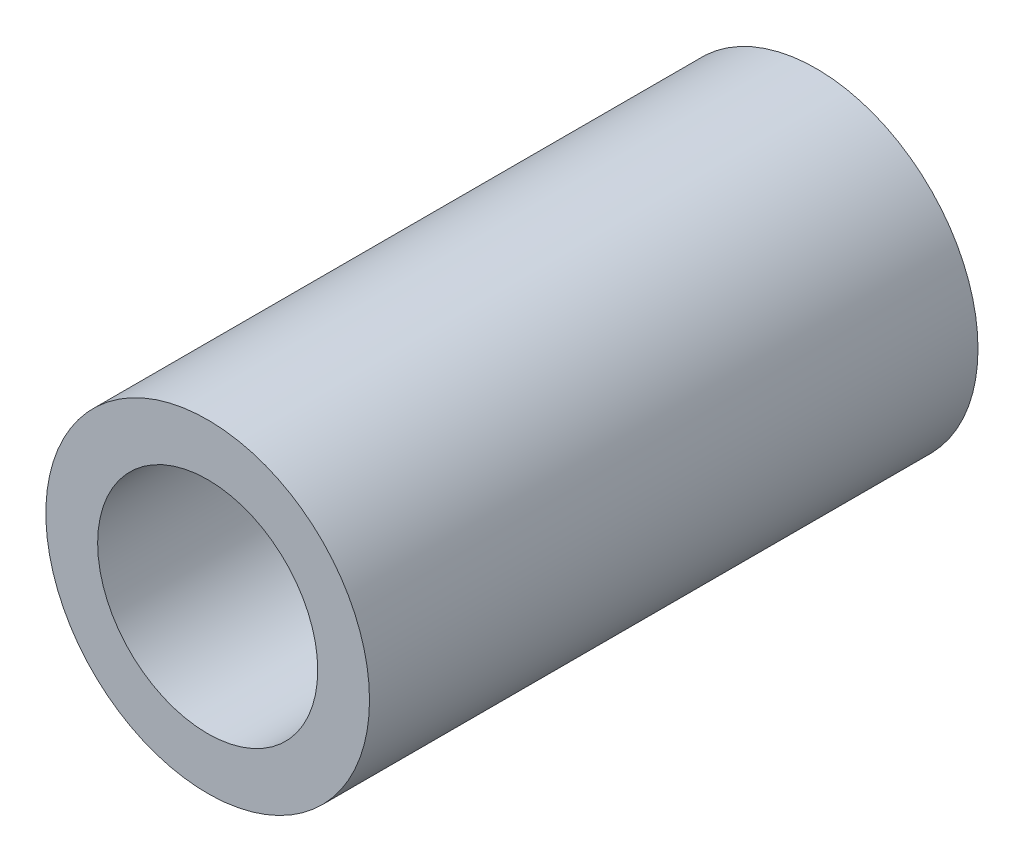
ISO-10303-21;
HEADER;
FILE_DESCRIPTION(('STEP AP214'),'2;1');
FILE_NAME('part.step','',(''),(''),'','','');
FILE_SCHEMA(('AUTOMOTIVE_DESIGN { 1 0 10303 214 1 1 1 1 }'));
ENDSEC;
DATA;
#1=APPLICATION_CONTEXT('core data for automotive mechanical design processes');
#2=APPLICATION_PROTOCOL_DEFINITION('international standard','automotive_design',2000,#1);
#3=PRODUCT_CONTEXT('',#1,'mechanical');
#4=PRODUCT('Part','Part','',(#3));
#5=PRODUCT_RELATED_PRODUCT_CATEGORY('part','',(#4));
#6=PRODUCT_DEFINITION_FORMATION('','',#4);
#7=PRODUCT_DEFINITION_CONTEXT('part definition',#1,'design');
#8=PRODUCT_DEFINITION('design','',#6,#7);
#9=PRODUCT_DEFINITION_SHAPE('','',#8);
#10=(LENGTH_UNIT() NAMED_UNIT(*) SI_UNIT(.MILLI.,.METRE.));
#11=(NAMED_UNIT(*) PLANE_ANGLE_UNIT() SI_UNIT($,.RADIAN.));
#12=(NAMED_UNIT(*) SI_UNIT($,.STERADIAN.) SOLID_ANGLE_UNIT());
#13=UNCERTAINTY_MEASURE_WITH_UNIT(LENGTH_MEASURE(1.E-05),#10,'distance_accuracy_value','');
#14=(GEOMETRIC_REPRESENTATION_CONTEXT(3) GLOBAL_UNCERTAINTY_ASSIGNED_CONTEXT((#13)) GLOBAL_UNIT_ASSIGNED_CONTEXT((#10,
#11,#12)) REPRESENTATION_CONTEXT('',''));
#15=CARTESIAN_POINT('',(0.,0.,0.));
#16=DIRECTION('',(0.,0.,1.));
#17=DIRECTION('',(1.,0.,0.));
#18=AXIS2_PLACEMENT_3D('',#15,#16,#17);
#19=CARTESIAN_POINT('',(0.,0.,9.4));
#20=DIRECTION('',(0.,0.,-1.));
#21=DIRECTION('',(-1.,0.,0.));
#22=AXIS2_PLACEMENT_3D('',#19,#20,#21);
#23=CYLINDRICAL_SURFACE('',#22,2.5);
#24=CARTESIAN_POINT('',(0.,0.,9.4));
#25=DIRECTION('',(0.,0.,1.));
#26=DIRECTION('',(1.,0.,0.));
#27=AXIS2_PLACEMENT_3D('',#24,#25,#26);
#28=CIRCLE('',#27,2.5);
#29=CARTESIAN_POINT('',(2.5,0.,9.4));
#30=VERTEX_POINT('',#29);
#31=EDGE_CURVE('E10',#30,#30,#28,.T.);
#32=ORIENTED_EDGE('',*,*,#31,.F.);
#33=EDGE_LOOP('',(#32));
#34=FACE_BOUND('',#33,.T.);
#35=CARTESIAN_POINT('',(0.,0.,0.));
#36=DIRECTION('',(0.,0.,1.));
#37=DIRECTION('',(1.,0.,0.));
#38=AXIS2_PLACEMENT_3D('',#35,#36,#37);
#39=CIRCLE('',#38,2.5);
#40=CARTESIAN_POINT('',(2.5,0.,0.));
#41=VERTEX_POINT('',#40);
#42=EDGE_CURVE('E49',#41,#41,#39,.T.);
#43=ORIENTED_EDGE('',*,*,#42,.T.);
#44=EDGE_LOOP('',(#43));
#45=FACE_BOUND('',#44,.T.);
#46=ADVANCED_FACE('F41',(#34,#45),#23,.T.);
#47=CARTESIAN_POINT('',(0.,0.,9.4));
#48=DIRECTION('',(0.,0.,1.));
#49=DIRECTION('',(1.,0.,0.));
#50=AXIS2_PLACEMENT_3D('',#47,#48,#49);
#51=PLANE('',#50);
#52=CARTESIAN_POINT('',(0.,0.,9.400012));
#53=DIRECTION('',(0.,0.,1.));
#54=DIRECTION('',(1.,0.,0.));
#55=AXIS2_PLACEMENT_3D('',#52,#53,#54);
#56=CIRCLE('',#55,1.7);
#57=CARTESIAN_POINT('',(1.7,0.,9.400012));
#58=VERTEX_POINT('',#57);
#59=EDGE_CURVE('E62',#58,#58,#56,.T.);
#60=ORIENTED_EDGE('',*,*,#59,.F.);
#61=EDGE_LOOP('',(#60));
#62=FACE_BOUND('',#61,.T.);
#63=ORIENTED_EDGE('',*,*,#31,.T.);
#64=EDGE_LOOP('',(#63));
#65=FACE_BOUND('',#64,.T.);
#66=ADVANCED_FACE('F66',(#62,#65),#51,.T.);
#67=CARTESIAN_POINT('',(0.,0.,0.));
#68=DIRECTION('',(0.,0.,1.));
#69=DIRECTION('',(1.,0.,0.));
#70=AXIS2_PLACEMENT_3D('',#67,#68,#69);
#71=PLANE('',#70);
#72=CARTESIAN_POINT('',(0.,0.,0.));
#73=DIRECTION('',(0.,0.,1.));
#74=DIRECTION('',(1.,0.,0.));
#75=AXIS2_PLACEMENT_3D('',#72,#73,#74);
#76=CIRCLE('',#75,1.7);
#77=CARTESIAN_POINT('',(1.7,0.,0.));
#78=VERTEX_POINT('',#77);
#79=EDGE_CURVE('E54',#78,#78,#76,.T.);
#80=ORIENTED_EDGE('',*,*,#79,.T.);
#81=EDGE_LOOP('',(#80));
#82=FACE_BOUND('',#81,.T.);
#83=ORIENTED_EDGE('',*,*,#42,.F.);
#84=EDGE_LOOP('',(#83));
#85=FACE_BOUND('',#84,.T.);
#86=ADVANCED_FACE('F75',(#82,#85),#71,.F.);
#87=CARTESIAN_POINT('',(0.,0.,0.));
#88=DIRECTION('',(0.,0.,1.));
#89=DIRECTION('',(1.,0.,0.));
#90=AXIS2_PLACEMENT_3D('',#87,#88,#89);
#91=CYLINDRICAL_SURFACE('',#90,1.7);
#92=ORIENTED_EDGE('',*,*,#79,.F.);
#93=EDGE_LOOP('',(#92));
#94=FACE_BOUND('',#93,.T.);
#95=ORIENTED_EDGE('',*,*,#59,.T.);
#96=EDGE_LOOP('',(#95));
#97=FACE_BOUND('',#96,.T.);
#98=ADVANCED_FACE('F73',(#94,#97),#91,.F.);
#99=CLOSED_SHELL('',(#46,#66,#86,#98));
#100=MANIFOLD_SOLID_BREP('B2',#99);
#101=ADVANCED_BREP_SHAPE_REPRESENTATION('',(#18,#100),#14);
#102=SHAPE_DEFINITION_REPRESENTATION(#9,#101);
ENDSEC;
END-ISO-10303-21;
